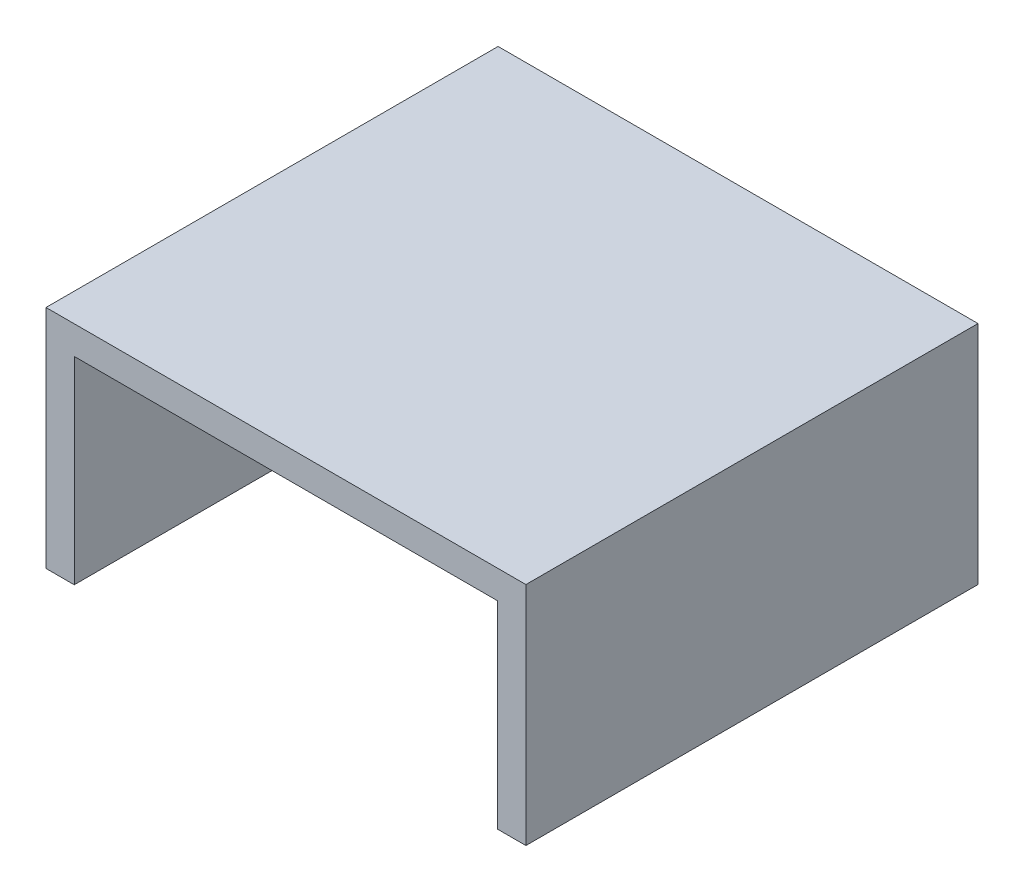
ISO-10303-21;
HEADER;
FILE_DESCRIPTION(('STEP AP214'),'2;1');
FILE_NAME('part.step','',(''),(''),'','','');
FILE_SCHEMA(('AUTOMOTIVE_DESIGN { 1 0 10303 214 1 1 1 1 }'));
ENDSEC;
DATA;
#1=APPLICATION_CONTEXT('core data for automotive mechanical design processes');
#2=APPLICATION_PROTOCOL_DEFINITION('international standard','automotive_design',2000,#1);
#3=PRODUCT_CONTEXT('',#1,'mechanical');
#4=PRODUCT('Part','Part','',(#3));
#5=PRODUCT_RELATED_PRODUCT_CATEGORY('part','',(#4));
#6=PRODUCT_DEFINITION_FORMATION('','',#4);
#7=PRODUCT_DEFINITION_CONTEXT('part definition',#1,'design');
#8=PRODUCT_DEFINITION('design','',#6,#7);
#9=PRODUCT_DEFINITION_SHAPE('','',#8);
#10=(LENGTH_UNIT() NAMED_UNIT(*) SI_UNIT(.MILLI.,.METRE.));
#11=(NAMED_UNIT(*) PLANE_ANGLE_UNIT() SI_UNIT($,.RADIAN.));
#12=(NAMED_UNIT(*) SI_UNIT($,.STERADIAN.) SOLID_ANGLE_UNIT());
#13=UNCERTAINTY_MEASURE_WITH_UNIT(LENGTH_MEASURE(1.E-05),#10,'distance_accuracy_value','');
#14=(GEOMETRIC_REPRESENTATION_CONTEXT(3) GLOBAL_UNCERTAINTY_ASSIGNED_CONTEXT((#13)) GLOBAL_UNIT_ASSIGNED_CONTEXT((#10,
#11,#12)) REPRESENTATION_CONTEXT('',''));
#15=CARTESIAN_POINT('',(0.,0.,0.));
#16=DIRECTION('',(0.,0.,1.));
#17=DIRECTION('',(1.,0.,0.));
#18=AXIS2_PLACEMENT_3D('',#15,#16,#17);
#19=CARTESIAN_POINT('',(-23.7871,-22.225,50.8));
#20=DIRECTION('',(0.,1.,0.));
#21=DIRECTION('',(-1.,0.,0.));
#22=AXIS2_PLACEMENT_3D('',#19,#20,#21);
#23=PLANE('',#22);
#24=DIRECTION('',(1.,0.,0.));
#25=VECTOR('',#24,1.);
#26=CARTESIAN_POINT('',(-23.7871,-22.225,0.));
#27=LINE('',#26,#25);
#28=CARTESIAN_POINT('',(-26.9621,-22.225,0.));
#29=VERTEX_POINT('',#28);
#30=CARTESIAN_POINT('',(-23.7871,-22.225,0.));
#31=VERTEX_POINT('',#30);
#32=EDGE_CURVE('E133',#29,#31,#27,.T.);
#33=ORIENTED_EDGE('',*,*,#32,.T.);
#34=DIRECTION('',(0.,0.,-1.));
#35=VECTOR('',#34,1.);
#36=CARTESIAN_POINT('',(-23.7871,-22.225,50.8));
#37=LINE('',#36,#35);
#38=CARTESIAN_POINT('',(-23.7871,-22.225,50.8));
#39=VERTEX_POINT('',#38);
#40=EDGE_CURVE('E11',#39,#31,#37,.T.);
#41=ORIENTED_EDGE('',*,*,#40,.F.);
#42=DIRECTION('',(1.,0.,0.));
#43=VECTOR('',#42,1.);
#44=CARTESIAN_POINT('',(-23.7871,-22.225,50.8));
#45=LINE('',#44,#43);
#46=CARTESIAN_POINT('',(-26.9621,-22.225,50.8));
#47=VERTEX_POINT('',#46);
#48=EDGE_CURVE('E147',#47,#39,#45,.T.);
#49=ORIENTED_EDGE('',*,*,#48,.F.);
#50=DIRECTION('',(0.,0.,-1.));
#51=VECTOR('',#50,1.);
#52=CARTESIAN_POINT('',(-26.9621,-22.225,50.8));
#53=LINE('',#52,#51);
#54=EDGE_CURVE('E129',#47,#29,#53,.T.);
#55=ORIENTED_EDGE('',*,*,#54,.T.);
#56=EDGE_LOOP('',(#33,#41,#49,#55));
#57=FACE_BOUND('',#56,.T.);
#58=ADVANCED_FACE('F37',(#57),#23,.F.);
#59=CARTESIAN_POINT('',(-23.7871,0.,50.8));
#60=DIRECTION('',(-1.,0.,0.));
#61=DIRECTION('',(0.,-1.,0.));
#62=AXIS2_PLACEMENT_3D('',#59,#60,#61);
#63=PLANE('',#62);
#64=DIRECTION('',(0.,1.,0.));
#65=VECTOR('',#64,1.);
#66=CARTESIAN_POINT('',(-23.7871,0.,0.));
#67=LINE('',#66,#65);
#68=CARTESIAN_POINT('',(-23.7871,0.,0.));
#69=VERTEX_POINT('',#68);
#70=EDGE_CURVE('E136',#31,#69,#67,.T.);
#71=ORIENTED_EDGE('',*,*,#70,.T.);
#72=DIRECTION('',(0.,0.,-1.));
#73=VECTOR('',#72,1.);
#74=CARTESIAN_POINT('',(-23.7871,0.,50.8));
#75=LINE('',#74,#73);
#76=CARTESIAN_POINT('',(-23.7871,0.,50.8));
#77=VERTEX_POINT('',#76);
#78=EDGE_CURVE('E45',#77,#69,#75,.T.);
#79=ORIENTED_EDGE('',*,*,#78,.F.);
#80=DIRECTION('',(0.,1.,0.));
#81=VECTOR('',#80,1.);
#82=CARTESIAN_POINT('',(-23.7871,0.,50.8));
#83=LINE('',#82,#81);
#84=EDGE_CURVE('E96',#39,#77,#83,.T.);
#85=ORIENTED_EDGE('',*,*,#84,.F.);
#86=ORIENTED_EDGE('',*,*,#40,.T.);
#87=EDGE_LOOP('',(#71,#79,#85,#86));
#88=FACE_BOUND('',#87,.T.);
#89=ADVANCED_FACE('F182',(#88),#63,.F.);
#90=CARTESIAN_POINT('',(23.7871,0.,50.8));
#91=DIRECTION('',(0.,1.,0.));
#92=DIRECTION('',(0.,0.,1.));
#93=AXIS2_PLACEMENT_3D('',#90,#91,#92);
#94=PLANE('',#93);
#95=DIRECTION('',(1.,0.,0.));
#96=VECTOR('',#95,1.);
#97=CARTESIAN_POINT('',(23.7871,0.,0.));
#98=LINE('',#97,#96);
#99=CARTESIAN_POINT('',(23.7871,0.,0.));
#100=VERTEX_POINT('',#99);
#101=EDGE_CURVE('E138',#69,#100,#98,.T.);
#102=ORIENTED_EDGE('',*,*,#101,.T.);
#103=DIRECTION('',(0.,0.,-1.));
#104=VECTOR('',#103,1.);
#105=CARTESIAN_POINT('',(23.7871,0.,50.8));
#106=LINE('',#105,#104);
#107=CARTESIAN_POINT('',(23.7871,0.,50.8));
#108=VERTEX_POINT('',#107);
#109=EDGE_CURVE('E154',#108,#100,#106,.T.);
#110=ORIENTED_EDGE('',*,*,#109,.F.);
#111=DIRECTION('',(1.,0.,0.));
#112=VECTOR('',#111,1.);
#113=CARTESIAN_POINT('',(23.7871,0.,50.8));
#114=LINE('',#113,#112);
#115=EDGE_CURVE('E162',#77,#108,#114,.T.);
#116=ORIENTED_EDGE('',*,*,#115,.F.);
#117=ORIENTED_EDGE('',*,*,#78,.T.);
#118=EDGE_LOOP('',(#102,#110,#116,#117));
#119=FACE_BOUND('',#118,.T.);
#120=ADVANCED_FACE('F160',(#119),#94,.F.);
#121=CARTESIAN_POINT('',(23.7871,-22.225,50.8));
#122=DIRECTION('',(1.,0.,0.));
#123=DIRECTION('',(0.,1.,0.));
#124=AXIS2_PLACEMENT_3D('',#121,#122,#123);
#125=PLANE('',#124);
#126=DIRECTION('',(0.,-1.,0.));
#127=VECTOR('',#126,1.);
#128=CARTESIAN_POINT('',(23.7871,-22.225,0.));
#129=LINE('',#128,#127);
#130=CARTESIAN_POINT('',(23.7871,-22.225,0.));
#131=VERTEX_POINT('',#130);
#132=EDGE_CURVE('E140',#100,#131,#129,.T.);
#133=ORIENTED_EDGE('',*,*,#132,.T.);
#134=DIRECTION('',(0.,0.,-1.));
#135=VECTOR('',#134,1.);
#136=CARTESIAN_POINT('',(23.7871,-22.225,50.8));
#137=LINE('',#136,#135);
#138=CARTESIAN_POINT('',(23.7871,-22.225,50.8));
#139=VERTEX_POINT('',#138);
#140=EDGE_CURVE('E151',#139,#131,#137,.T.);
#141=ORIENTED_EDGE('',*,*,#140,.F.);
#142=DIRECTION('',(0.,-1.,0.));
#143=VECTOR('',#142,1.);
#144=CARTESIAN_POINT('',(23.7871,-22.225,50.8));
#145=LINE('',#144,#143);
#146=EDGE_CURVE('E174',#108,#139,#145,.T.);
#147=ORIENTED_EDGE('',*,*,#146,.F.);
#148=ORIENTED_EDGE('',*,*,#109,.T.);
#149=EDGE_LOOP('',(#133,#141,#147,#148));
#150=FACE_BOUND('',#149,.T.);
#151=ADVANCED_FACE('F170',(#150),#125,.F.);
#152=CARTESIAN_POINT('',(26.9621,-22.225,50.8));
#153=DIRECTION('',(0.,1.,0.));
#154=DIRECTION('',(-1.,0.,0.));
#155=AXIS2_PLACEMENT_3D('',#152,#153,#154);
#156=PLANE('',#155);
#157=DIRECTION('',(1.,0.,0.));
#158=VECTOR('',#157,1.);
#159=CARTESIAN_POINT('',(26.9621,-22.225,0.));
#160=LINE('',#159,#158);
#161=CARTESIAN_POINT('',(26.9621,-22.225,0.));
#162=VERTEX_POINT('',#161);
#163=EDGE_CURVE('E142',#131,#162,#160,.T.);
#164=ORIENTED_EDGE('',*,*,#163,.T.);
#165=DIRECTION('',(0.,0.,-1.));
#166=VECTOR('',#165,1.);
#167=CARTESIAN_POINT('',(26.9621,-22.225,50.8));
#168=LINE('',#167,#166);
#169=CARTESIAN_POINT('',(26.9621,-22.225,50.8));
#170=VERTEX_POINT('',#169);
#171=EDGE_CURVE('E124',#170,#162,#168,.T.);
#172=ORIENTED_EDGE('',*,*,#171,.F.);
#173=DIRECTION('',(1.,0.,0.));
#174=VECTOR('',#173,1.);
#175=CARTESIAN_POINT('',(26.9621,-22.225,50.8));
#176=LINE('',#175,#174);
#177=EDGE_CURVE('E115',#139,#170,#176,.T.);
#178=ORIENTED_EDGE('',*,*,#177,.F.);
#179=ORIENTED_EDGE('',*,*,#140,.T.);
#180=EDGE_LOOP('',(#164,#172,#178,#179));
#181=FACE_BOUND('',#180,.T.);
#182=ADVANCED_FACE('F173',(#181),#156,.F.);
#183=CARTESIAN_POINT('',(26.9621,3.17499999999999,50.8));
#184=DIRECTION('',(-1.,0.,0.));
#185=DIRECTION('',(0.,-1.,0.));
#186=AXIS2_PLACEMENT_3D('',#183,#184,#185);
#187=PLANE('',#186);
#188=DIRECTION('',(0.,1.,0.));
#189=VECTOR('',#188,1.);
#190=CARTESIAN_POINT('',(26.9621,3.17499999999999,0.));
#191=LINE('',#190,#189);
#192=CARTESIAN_POINT('',(26.9621,3.17499999999999,0.));
#193=VERTEX_POINT('',#192);
#194=EDGE_CURVE('E123',#162,#193,#191,.T.);
#195=ORIENTED_EDGE('',*,*,#194,.T.);
#196=DIRECTION('',(0.,0.,-1.));
#197=VECTOR('',#196,1.);
#198=CARTESIAN_POINT('',(26.9621,3.17499999999999,50.8));
#199=LINE('',#198,#197);
#200=CARTESIAN_POINT('',(26.9621,3.17499999999999,50.8));
#201=VERTEX_POINT('',#200);
#202=EDGE_CURVE('E120',#201,#193,#199,.T.);
#203=ORIENTED_EDGE('',*,*,#202,.F.);
#204=DIRECTION('',(0.,1.,0.));
#205=VECTOR('',#204,1.);
#206=CARTESIAN_POINT('',(26.9621,3.17499999999999,50.8));
#207=LINE('',#206,#205);
#208=EDGE_CURVE('E109',#170,#201,#207,.T.);
#209=ORIENTED_EDGE('',*,*,#208,.F.);
#210=ORIENTED_EDGE('',*,*,#171,.T.);
#211=EDGE_LOOP('',(#195,#203,#209,#210));
#212=FACE_BOUND('',#211,.T.);
#213=ADVANCED_FACE('F121',(#212),#187,.F.);
#214=CARTESIAN_POINT('',(-26.9621,3.17499999999999,50.8));
#215=DIRECTION('',(0.,-1.,0.));
#216=DIRECTION('',(0.,0.,-1.));
#217=AXIS2_PLACEMENT_3D('',#214,#215,#216);
#218=PLANE('',#217);
#219=DIRECTION('',(-1.,0.,0.));
#220=VECTOR('',#219,1.);
#221=CARTESIAN_POINT('',(-26.9621,3.17499999999999,0.));
#222=LINE('',#221,#220);
#223=CARTESIAN_POINT('',(-26.9621,3.17499999999999,0.));
#224=VERTEX_POINT('',#223);
#225=EDGE_CURVE('E82',#193,#224,#222,.T.);
#226=ORIENTED_EDGE('',*,*,#225,.T.);
#227=DIRECTION('',(0.,0.,-1.));
#228=VECTOR('',#227,1.);
#229=CARTESIAN_POINT('',(-26.9621,3.17499999999999,50.8));
#230=LINE('',#229,#228);
#231=CARTESIAN_POINT('',(-26.9621,3.17499999999999,50.8));
#232=VERTEX_POINT('',#231);
#233=EDGE_CURVE('E125',#232,#224,#230,.T.);
#234=ORIENTED_EDGE('',*,*,#233,.F.);
#235=DIRECTION('',(-1.,0.,0.));
#236=VECTOR('',#235,1.);
#237=CARTESIAN_POINT('',(-26.9621,3.17499999999999,50.8));
#238=LINE('',#237,#236);
#239=EDGE_CURVE('E113',#201,#232,#238,.T.);
#240=ORIENTED_EDGE('',*,*,#239,.F.);
#241=ORIENTED_EDGE('',*,*,#202,.T.);
#242=EDGE_LOOP('',(#226,#234,#240,#241));
#243=FACE_BOUND('',#242,.T.);
#244=ADVANCED_FACE('F127',(#243),#218,.F.);
#245=CARTESIAN_POINT('',(-26.9621,-22.225,50.8));
#246=DIRECTION('',(1.,0.,0.));
#247=DIRECTION('',(0.,1.,0.));
#248=AXIS2_PLACEMENT_3D('',#245,#246,#247);
#249=PLANE('',#248);
#250=DIRECTION('',(0.,-1.,0.));
#251=VECTOR('',#250,1.);
#252=CARTESIAN_POINT('',(-26.9621,-22.225,0.));
#253=LINE('',#252,#251);
#254=EDGE_CURVE('E88',#224,#29,#253,.T.);
#255=ORIENTED_EDGE('',*,*,#254,.T.);
#256=ORIENTED_EDGE('',*,*,#54,.F.);
#257=DIRECTION('',(0.,-1.,0.));
#258=VECTOR('',#257,1.);
#259=CARTESIAN_POINT('',(-26.9621,-22.225,50.8));
#260=LINE('',#259,#258);
#261=EDGE_CURVE('E53',#232,#47,#260,.T.);
#262=ORIENTED_EDGE('',*,*,#261,.F.);
#263=ORIENTED_EDGE('',*,*,#233,.T.);
#264=EDGE_LOOP('',(#255,#256,#262,#263));
#265=FACE_BOUND('',#264,.T.);
#266=ADVANCED_FACE('F198',(#265),#249,.F.);
#267=CARTESIAN_POINT('',(0.,0.,50.8));
#268=DIRECTION('',(0.,0.,-1.));
#269=DIRECTION('',(-1.,0.,0.));
#270=AXIS2_PLACEMENT_3D('',#267,#268,#269);
#271=PLANE('',#270);
#272=ORIENTED_EDGE('',*,*,#48,.T.);
#273=ORIENTED_EDGE('',*,*,#84,.T.);
#274=ORIENTED_EDGE('',*,*,#115,.T.);
#275=ORIENTED_EDGE('',*,*,#146,.T.);
#276=ORIENTED_EDGE('',*,*,#177,.T.);
#277=ORIENTED_EDGE('',*,*,#208,.T.);
#278=ORIENTED_EDGE('',*,*,#239,.T.);
#279=ORIENTED_EDGE('',*,*,#261,.T.);
#280=EDGE_LOOP('',(#272,#273,#274,#275,#276,#277,#278,#279));
#281=FACE_BOUND('',#280,.T.);
#282=ADVANCED_FACE('F111',(#281),#271,.F.);
#283=CARTESIAN_POINT('',(0.,0.,0.));
#284=DIRECTION('',(0.,0.,-1.));
#285=DIRECTION('',(-1.,0.,0.));
#286=AXIS2_PLACEMENT_3D('',#283,#284,#285);
#287=PLANE('',#286);
#288=ORIENTED_EDGE('',*,*,#32,.F.);
#289=ORIENTED_EDGE('',*,*,#254,.F.);
#290=ORIENTED_EDGE('',*,*,#225,.F.);
#291=ORIENTED_EDGE('',*,*,#194,.F.);
#292=ORIENTED_EDGE('',*,*,#163,.F.);
#293=ORIENTED_EDGE('',*,*,#132,.F.);
#294=ORIENTED_EDGE('',*,*,#101,.F.);
#295=ORIENTED_EDGE('',*,*,#70,.F.);
#296=EDGE_LOOP('',(#288,#289,#290,#291,#292,#293,#294,#295));
#297=FACE_BOUND('',#296,.T.);
#298=ADVANCED_FACE('F166',(#297),#287,.T.);
#299=CLOSED_SHELL('',(#58,#89,#120,#151,#182,#213,#244,#266,#282,#298));
#300=MANIFOLD_SOLID_BREP('B2',#299);
#301=ADVANCED_BREP_SHAPE_REPRESENTATION('',(#18,#300),#14);
#302=SHAPE_DEFINITION_REPRESENTATION(#9,#301);
ENDSEC;
END-ISO-10303-21;
